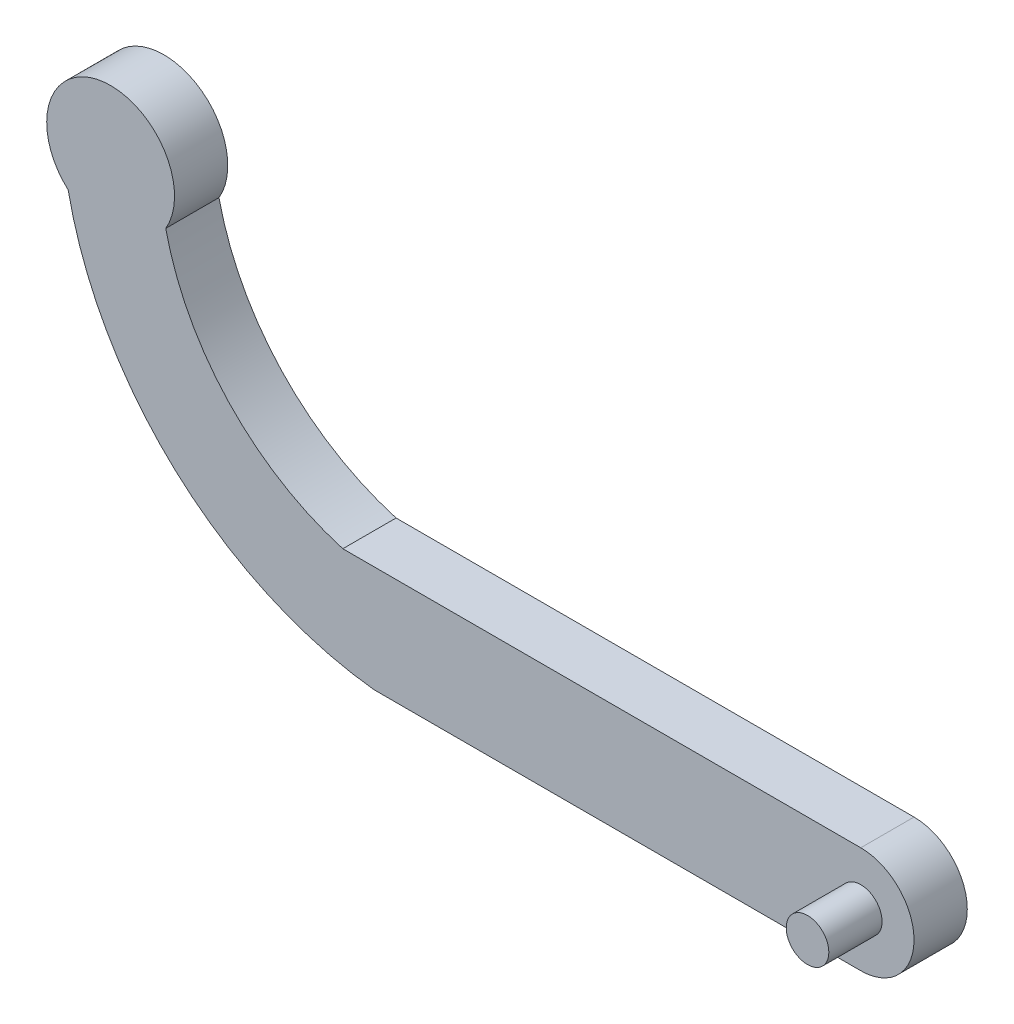
ISO-10303-21;
HEADER;
FILE_DESCRIPTION(('STEP AP214'),'2;1');
FILE_NAME('part.step','',(''),(''),'','','');
FILE_SCHEMA(('AUTOMOTIVE_DESIGN { 1 0 10303 214 1 1 1 1 }'));
ENDSEC;
DATA;
#1=APPLICATION_CONTEXT('core data for automotive mechanical design processes');
#2=APPLICATION_PROTOCOL_DEFINITION('international standard','automotive_design',2000,#1);
#3=PRODUCT_CONTEXT('',#1,'mechanical');
#4=PRODUCT('Part','Part','',(#3));
#5=PRODUCT_RELATED_PRODUCT_CATEGORY('part','',(#4));
#6=PRODUCT_DEFINITION_FORMATION('','',#4);
#7=PRODUCT_DEFINITION_CONTEXT('part definition',#1,'design');
#8=PRODUCT_DEFINITION('design','',#6,#7);
#9=PRODUCT_DEFINITION_SHAPE('','',#8);
#10=(LENGTH_UNIT() NAMED_UNIT(*) SI_UNIT(.MILLI.,.METRE.));
#11=(NAMED_UNIT(*) PLANE_ANGLE_UNIT() SI_UNIT($,.RADIAN.));
#12=(NAMED_UNIT(*) SI_UNIT($,.STERADIAN.) SOLID_ANGLE_UNIT());
#13=UNCERTAINTY_MEASURE_WITH_UNIT(LENGTH_MEASURE(1.E-05),#10,'distance_accuracy_value','');
#14=(GEOMETRIC_REPRESENTATION_CONTEXT(3) GLOBAL_UNCERTAINTY_ASSIGNED_CONTEXT((#13)) GLOBAL_UNIT_ASSIGNED_CONTEXT((#10,
#11,#12)) REPRESENTATION_CONTEXT('',''));
#15=CARTESIAN_POINT('',(0.,0.,0.));
#16=DIRECTION('',(0.,0.,1.));
#17=DIRECTION('',(1.,0.,0.));
#18=AXIS2_PLACEMENT_3D('',#15,#16,#17);
#19=CARTESIAN_POINT('',(-19.2924587651083,28.7084113729155,5.));
#20=DIRECTION('',(0.,0.,-1.));
#21=DIRECTION('',(-1.,0.,0.));
#22=AXIS2_PLACEMENT_3D('',#19,#20,#21);
#23=CYLINDRICAL_SURFACE('',#22,23.8526946732791);
#24=CARTESIAN_POINT('',(-19.2924587651083,28.7084113729155,0.));
#25=DIRECTION('',(0.,0.,-1.));
#26=DIRECTION('',(1.,0.,0.));
#27=AXIS2_PLACEMENT_3D('',#24,#25,#26);
#28=CIRCLE('',#27,23.8526946732791);
#29=CARTESIAN_POINT('',(-25.9536643251366,5.80471333823716,0.));
#30=VERTEX_POINT('',#29);
#31=CARTESIAN_POINT('',(-42.5787439773952,23.5412105650593,0.));
#32=VERTEX_POINT('',#31);
#33=EDGE_CURVE('E117',#30,#32,#28,.T.);
#34=ORIENTED_EDGE('',*,*,#33,.T.);
#35=DIRECTION('',(0.,0.,-1.));
#36=VECTOR('',#35,1.);
#37=CARTESIAN_POINT('',(-42.5787439773952,23.5412105650593,5.));
#38=LINE('',#37,#36);
#39=CARTESIAN_POINT('',(-42.5787439773952,23.5412105650593,5.));
#40=VERTEX_POINT('',#39);
#41=EDGE_CURVE('E11',#40,#32,#38,.T.);
#42=ORIENTED_EDGE('',*,*,#41,.F.);
#43=CARTESIAN_POINT('',(-19.2924587651083,28.7084113729155,5.));
#44=DIRECTION('',(0.,0.,-1.));
#45=DIRECTION('',(1.,0.,0.));
#46=AXIS2_PLACEMENT_3D('',#43,#44,#45);
#47=CIRCLE('',#46,23.8526946732791);
#48=CARTESIAN_POINT('',(-25.9536643251366,5.80471333823716,5.));
#49=VERTEX_POINT('',#48);
#50=EDGE_CURVE('E128',#49,#40,#47,.T.);
#51=ORIENTED_EDGE('',*,*,#50,.F.);
#52=DIRECTION('',(0.,0.,-1.));
#53=VECTOR('',#52,1.);
#54=CARTESIAN_POINT('',(-25.9536643251366,5.80471333823716,5.));
#55=LINE('',#54,#53);
#56=EDGE_CURVE('E113',#49,#30,#55,.T.);
#57=ORIENTED_EDGE('',*,*,#56,.T.);
#58=EDGE_LOOP('',(#34,#42,#51,#57));
#59=FACE_BOUND('',#58,.T.);
#60=ADVANCED_FACE('F33',(#59),#23,.F.);
#61=CARTESIAN_POINT('',(-47.7560673642883,26.5735895894443,5.));
#62=DIRECTION('',(0.,0.,-1.));
#63=DIRECTION('',(-1.,0.,0.));
#64=AXIS2_PLACEMENT_3D('',#61,#62,#63);
#65=CYLINDRICAL_SURFACE('',#64,6.);
#66=CARTESIAN_POINT('',(-47.7560673642883,26.5735895894443,0.));
#67=DIRECTION('',(0.,0.,1.));
#68=DIRECTION('',(1.,0.,0.));
#69=AXIS2_PLACEMENT_3D('',#66,#67,#68);
#70=CIRCLE('',#69,6.);
#71=CARTESIAN_POINT('',(-51.7412575093746,22.0882513070505,0.));
#72=VERTEX_POINT('',#71);
#73=EDGE_CURVE('E120',#32,#72,#70,.T.);
#74=ORIENTED_EDGE('',*,*,#73,.T.);
#75=DIRECTION('',(0.,0.,-1.));
#76=VECTOR('',#75,1.);
#77=CARTESIAN_POINT('',(-51.7412575093746,22.0882513070505,5.));
#78=LINE('',#77,#76);
#79=CARTESIAN_POINT('',(-51.7412575093746,22.0882513070505,5.));
#80=VERTEX_POINT('',#79);
#81=EDGE_CURVE('E41',#80,#72,#78,.T.);
#82=ORIENTED_EDGE('',*,*,#81,.F.);
#83=CARTESIAN_POINT('',(-47.7560673642883,26.5735895894443,5.));
#84=DIRECTION('',(0.,0.,1.));
#85=DIRECTION('',(1.,0.,0.));
#86=AXIS2_PLACEMENT_3D('',#83,#84,#85);
#87=CIRCLE('',#86,6.);
#88=EDGE_CURVE('E86',#40,#80,#87,.T.);
#89=ORIENTED_EDGE('',*,*,#88,.F.);
#90=ORIENTED_EDGE('',*,*,#41,.T.);
#91=EDGE_LOOP('',(#74,#82,#89,#90));
#92=FACE_BOUND('',#91,.T.);
#93=ADVANCED_FACE('F153',(#92),#65,.T.);
#94=CARTESIAN_POINT('',(-19.2924587651083,28.7084113729155,5.));
#95=DIRECTION('',(0.,0.,-1.));
#96=DIRECTION('',(-1.,0.,0.));
#97=AXIS2_PLACEMENT_3D('',#94,#95,#96);
#98=CYLINDRICAL_SURFACE('',#97,33.1172320589081);
#99=CARTESIAN_POINT('',(-19.2924587651083,28.7084113729155,0.));
#100=DIRECTION('',(0.,0.,1.));
#101=DIRECTION('',(1.,0.,0.));
#102=AXIS2_PLACEMENT_3D('',#99,#100,#101);
#103=CIRCLE('',#102,33.1172320589081);
#104=CARTESIAN_POINT('',(-23.0471511474845,-4.19528666176284,0.));
#105=VERTEX_POINT('',#104);
#106=EDGE_CURVE('E123',#72,#105,#103,.T.);
#107=ORIENTED_EDGE('',*,*,#106,.T.);
#108=DIRECTION('',(0.,0.,-1.));
#109=VECTOR('',#108,1.);
#110=CARTESIAN_POINT('',(-23.0471511474845,-4.19528666176284,5.));
#111=LINE('',#110,#109);
#112=CARTESIAN_POINT('',(-23.0471511474845,-4.19528666176284,5.));
#113=VERTEX_POINT('',#112);
#114=EDGE_CURVE('E108',#113,#105,#111,.T.);
#115=ORIENTED_EDGE('',*,*,#114,.F.);
#116=CARTESIAN_POINT('',(-19.2924587651083,28.7084113729155,5.));
#117=DIRECTION('',(0.,0.,1.));
#118=DIRECTION('',(1.,0.,0.));
#119=AXIS2_PLACEMENT_3D('',#116,#117,#118);
#120=CIRCLE('',#119,33.1172320589081);
#121=EDGE_CURVE('E99',#80,#113,#120,.T.);
#122=ORIENTED_EDGE('',*,*,#121,.F.);
#123=ORIENTED_EDGE('',*,*,#81,.T.);
#124=EDGE_LOOP('',(#107,#115,#122,#123));
#125=FACE_BOUND('',#124,.T.);
#126=ADVANCED_FACE('F134',(#125),#98,.T.);
#127=CARTESIAN_POINT('',(-23.0471511474845,-4.19528666176284,5.));
#128=DIRECTION('',(0.,1.,0.));
#129=DIRECTION('',(-1.,0.,0.));
#130=AXIS2_PLACEMENT_3D('',#127,#128,#129);
#131=PLANE('',#130);
#132=DIRECTION('',(1.,0.,0.));
#133=VECTOR('',#132,1.);
#134=CARTESIAN_POINT('',(-23.0471511474845,-4.19528666176284,0.));
#135=LINE('',#134,#133);
#136=CARTESIAN_POINT('',(22.6780509076825,-4.19528666176284,0.));
#137=VERTEX_POINT('',#136);
#138=EDGE_CURVE('E107',#105,#137,#135,.T.);
#139=ORIENTED_EDGE('',*,*,#138,.T.);
#140=DIRECTION('',(0.,0.,-1.));
#141=VECTOR('',#140,1.);
#142=CARTESIAN_POINT('',(22.6780509076825,-4.19528666176284,5.));
#143=LINE('',#142,#141);
#144=CARTESIAN_POINT('',(22.6780509076825,-4.19528666176284,5.));
#145=VERTEX_POINT('',#144);
#146=EDGE_CURVE('E104',#145,#137,#143,.T.);
#147=ORIENTED_EDGE('',*,*,#146,.F.);
#148=DIRECTION('',(1.,0.,0.));
#149=VECTOR('',#148,1.);
#150=CARTESIAN_POINT('',(-23.0471511474845,-4.19528666176284,5.));
#151=LINE('',#150,#149);
#152=EDGE_CURVE('E93',#113,#145,#151,.T.);
#153=ORIENTED_EDGE('',*,*,#152,.F.);
#154=ORIENTED_EDGE('',*,*,#114,.T.);
#155=EDGE_LOOP('',(#139,#147,#153,#154));
#156=FACE_BOUND('',#155,.T.);
#157=ADVANCED_FACE('F105',(#156),#131,.F.);
#158=CARTESIAN_POINT('',(22.6780509076825,0.804713338237159,5.));
#159=DIRECTION('',(0.,0.,-1.));
#160=DIRECTION('',(-1.,0.,0.));
#161=AXIS2_PLACEMENT_3D('',#158,#159,#160);
#162=CYLINDRICAL_SURFACE('',#161,5.);
#163=CARTESIAN_POINT('',(22.6780509076825,0.804713338237159,0.));
#164=DIRECTION('',(0.,0.,1.));
#165=DIRECTION('',(1.,0.,0.));
#166=AXIS2_PLACEMENT_3D('',#163,#164,#165);
#167=CIRCLE('',#166,5.);
#168=CARTESIAN_POINT('',(22.6780509076825,5.80471333823716,0.));
#169=VERTEX_POINT('',#168);
#170=EDGE_CURVE('E72',#137,#169,#167,.T.);
#171=ORIENTED_EDGE('',*,*,#170,.T.);
#172=DIRECTION('',(0.,0.,-1.));
#173=VECTOR('',#172,1.);
#174=CARTESIAN_POINT('',(22.6780509076825,5.80471333823716,5.));
#175=LINE('',#174,#173);
#176=CARTESIAN_POINT('',(22.6780509076825,5.80471333823716,5.));
#177=VERTEX_POINT('',#176);
#178=EDGE_CURVE('E109',#177,#169,#175,.T.);
#179=ORIENTED_EDGE('',*,*,#178,.F.);
#180=CARTESIAN_POINT('',(22.6780509076825,0.804713338237159,5.));
#181=DIRECTION('',(0.,0.,1.));
#182=DIRECTION('',(1.,0.,0.));
#183=AXIS2_PLACEMENT_3D('',#180,#181,#182);
#184=CIRCLE('',#183,5.);
#185=EDGE_CURVE('E97',#145,#177,#184,.T.);
#186=ORIENTED_EDGE('',*,*,#185,.F.);
#187=ORIENTED_EDGE('',*,*,#146,.T.);
#188=EDGE_LOOP('',(#171,#179,#186,#187));
#189=FACE_BOUND('',#188,.T.);
#190=ADVANCED_FACE('F111',(#189),#162,.T.);
#191=CARTESIAN_POINT('',(-25.9536643251366,5.80471333823716,5.));
#192=DIRECTION('',(0.,-1.,0.));
#193=DIRECTION('',(1.,0.,0.));
#194=AXIS2_PLACEMENT_3D('',#191,#192,#193);
#195=PLANE('',#194);
#196=DIRECTION('',(-1.,0.,0.));
#197=VECTOR('',#196,1.);
#198=CARTESIAN_POINT('',(-25.9536643251366,5.80471333823716,0.));
#199=LINE('',#198,#197);
#200=EDGE_CURVE('E78',#169,#30,#199,.T.);
#201=ORIENTED_EDGE('',*,*,#200,.T.);
#202=ORIENTED_EDGE('',*,*,#56,.F.);
#203=DIRECTION('',(-1.,0.,0.));
#204=VECTOR('',#203,1.);
#205=CARTESIAN_POINT('',(-25.9536643251366,5.80471333823716,5.));
#206=LINE('',#205,#204);
#207=EDGE_CURVE('E49',#177,#49,#206,.T.);
#208=ORIENTED_EDGE('',*,*,#207,.F.);
#209=ORIENTED_EDGE('',*,*,#178,.T.);
#210=EDGE_LOOP('',(#201,#202,#208,#209));
#211=FACE_BOUND('',#210,.T.);
#212=ADVANCED_FACE('F141',(#211),#195,.F.);
#213=CARTESIAN_POINT('',(-19.2924587651083,28.7084113729155,5.));
#214=DIRECTION('',(0.,0.,1.));
#215=DIRECTION('',(1.,0.,0.));
#216=AXIS2_PLACEMENT_3D('',#213,#214,#215);
#217=PLANE('',#216);
#218=CARTESIAN_POINT('',(22.6780509076825,0.804713338237159,5.));
#219=DIRECTION('',(0.,0.,1.));
#220=DIRECTION('',(1.,0.,0.));
#221=AXIS2_PLACEMENT_3D('',#218,#219,#220);
#222=CIRCLE('',#221,2.);
#223=CARTESIAN_POINT('',(24.6780509076825,0.804713338237159,5.));
#224=VERTEX_POINT('',#223);
#225=EDGE_CURVE('E214',#224,#224,#222,.T.);
#226=ORIENTED_EDGE('',*,*,#225,.F.);
#227=EDGE_LOOP('',(#226));
#228=FACE_BOUND('',#227,.T.);
#229=ORIENTED_EDGE('',*,*,#50,.T.);
#230=ORIENTED_EDGE('',*,*,#88,.T.);
#231=ORIENTED_EDGE('',*,*,#121,.T.);
#232=ORIENTED_EDGE('',*,*,#152,.T.);
#233=ORIENTED_EDGE('',*,*,#185,.T.);
#234=ORIENTED_EDGE('',*,*,#207,.T.);
#235=EDGE_LOOP('',(#229,#230,#231,#232,#233,#234));
#236=FACE_BOUND('',#235,.T.);
#237=ADVANCED_FACE('F95',(#228,#236),#217,.T.);
#238=CARTESIAN_POINT('',(-19.2924587651083,28.7084113729155,0.));
#239=DIRECTION('',(0.,0.,1.));
#240=DIRECTION('',(1.,0.,0.));
#241=AXIS2_PLACEMENT_3D('',#238,#239,#240);
#242=PLANE('',#241);
#243=ORIENTED_EDGE('',*,*,#33,.F.);
#244=ORIENTED_EDGE('',*,*,#200,.F.);
#245=ORIENTED_EDGE('',*,*,#170,.F.);
#246=ORIENTED_EDGE('',*,*,#138,.F.);
#247=ORIENTED_EDGE('',*,*,#106,.F.);
#248=ORIENTED_EDGE('',*,*,#73,.F.);
#249=EDGE_LOOP('',(#243,#244,#245,#246,#247,#248));
#250=FACE_BOUND('',#249,.T.);
#251=ADVANCED_FACE('F137',(#250),#242,.F.);
#252=CARTESIAN_POINT('',(22.6780509076825,0.804713338237159,10.));
#253=DIRECTION('',(0.,0.,-1.));
#254=DIRECTION('',(-1.,0.,0.));
#255=AXIS2_PLACEMENT_3D('',#252,#253,#254);
#256=CYLINDRICAL_SURFACE('',#255,2.);
#257=CARTESIAN_POINT('',(22.6780509076825,0.804713338237159,10.));
#258=DIRECTION('',(0.,0.,1.));
#259=DIRECTION('',(1.,0.,0.));
#260=AXIS2_PLACEMENT_3D('',#257,#258,#259);
#261=CIRCLE('',#260,2.);
#262=CARTESIAN_POINT('',(24.6780509076825,0.804713338237159,10.));
#263=VERTEX_POINT('',#262);
#264=EDGE_CURVE('E121',#263,#263,#261,.T.);
#265=ORIENTED_EDGE('',*,*,#264,.F.);
#266=EDGE_LOOP('',(#265));
#267=FACE_BOUND('',#266,.T.);
#268=ORIENTED_EDGE('',*,*,#225,.T.);
#269=EDGE_LOOP('',(#268));
#270=FACE_BOUND('',#269,.T.);
#271=ADVANCED_FACE('F185',(#267,#270),#256,.T.);
#272=CARTESIAN_POINT('',(22.6780509076825,0.804713338237159,10.));
#273=DIRECTION('',(0.,0.,1.));
#274=DIRECTION('',(1.,0.,0.));
#275=AXIS2_PLACEMENT_3D('',#272,#273,#274);
#276=PLANE('',#275);
#277=ORIENTED_EDGE('',*,*,#264,.T.);
#278=EDGE_LOOP('',(#277));
#279=FACE_BOUND('',#278,.T.);
#280=ADVANCED_FACE('F198',(#279),#276,.T.);
#281=CLOSED_SHELL('',(#60,#93,#126,#157,#190,#212,#237,#251,#271,#280));
#282=MANIFOLD_SOLID_BREP('B2',#281);
#283=ADVANCED_BREP_SHAPE_REPRESENTATION('',(#18,#282),#14);
#284=SHAPE_DEFINITION_REPRESENTATION(#9,#283);
ENDSEC;
END-ISO-10303-21;
